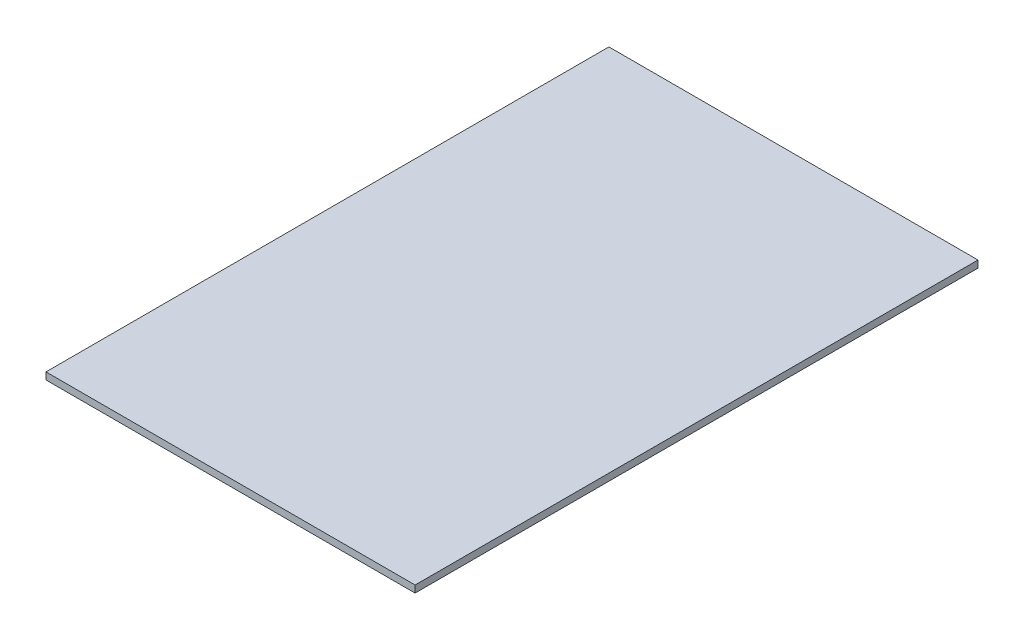
ISO-10303-21;
HEADER;
FILE_DESCRIPTION(('STEP AP214'),'2;1');
FILE_NAME('part.step','',(''),(''),'','','');
FILE_SCHEMA(('AUTOMOTIVE_DESIGN { 1 0 10303 214 1 1 1 1 }'));
ENDSEC;
DATA;
#1=APPLICATION_CONTEXT('core data for automotive mechanical design processes');
#2=APPLICATION_PROTOCOL_DEFINITION('international standard','automotive_design',2000,#1);
#3=PRODUCT_CONTEXT('',#1,'mechanical');
#4=PRODUCT('Part','Part','',(#3));
#5=PRODUCT_RELATED_PRODUCT_CATEGORY('part','',(#4));
#6=PRODUCT_DEFINITION_FORMATION('','',#4);
#7=PRODUCT_DEFINITION_CONTEXT('part definition',#1,'design');
#8=PRODUCT_DEFINITION('design','',#6,#7);
#9=PRODUCT_DEFINITION_SHAPE('','',#8);
#10=(LENGTH_UNIT() NAMED_UNIT(*) SI_UNIT(.MILLI.,.METRE.));
#11=(NAMED_UNIT(*) PLANE_ANGLE_UNIT() SI_UNIT($,.RADIAN.));
#12=(NAMED_UNIT(*) SI_UNIT($,.STERADIAN.) SOLID_ANGLE_UNIT());
#13=UNCERTAINTY_MEASURE_WITH_UNIT(LENGTH_MEASURE(1.E-05),#10,'distance_accuracy_value','');
#14=(GEOMETRIC_REPRESENTATION_CONTEXT(3) GLOBAL_UNCERTAINTY_ASSIGNED_CONTEXT((#13)) GLOBAL_UNIT_ASSIGNED_CONTEXT((#10,
#11,#12)) REPRESENTATION_CONTEXT('',''));
#15=CARTESIAN_POINT('',(0.,0.,0.));
#16=DIRECTION('',(0.,0.,1.));
#17=DIRECTION('',(1.,0.,0.));
#18=AXIS2_PLACEMENT_3D('',#15,#16,#17);
#19=CARTESIAN_POINT('',(500.,9.525,-762.5));
#20=DIRECTION('',(0.,0.,1.));
#21=DIRECTION('',(1.,0.,0.));
#22=AXIS2_PLACEMENT_3D('',#19,#20,#21);
#23=PLANE('',#22);
#24=DIRECTION('',(-1.,0.,0.));
#25=VECTOR('',#24,1.);
#26=CARTESIAN_POINT('',(500.,0.,-762.5));
#27=LINE('',#26,#25);
#28=CARTESIAN_POINT('',(500.,0.,-762.5));
#29=VERTEX_POINT('',#28);
#30=CARTESIAN_POINT('',(0.,0.,-762.5));
#31=VERTEX_POINT('',#30);
#32=EDGE_CURVE('E104',#29,#31,#27,.T.);
#33=ORIENTED_EDGE('',*,*,#32,.T.);
#34=DIRECTION('',(0.,-1.,0.));
#35=VECTOR('',#34,1.);
#36=CARTESIAN_POINT('',(0.,9.525,-762.5));
#37=LINE('',#36,#35);
#38=CARTESIAN_POINT('',(0.,9.525,-762.5));
#39=VERTEX_POINT('',#38);
#40=EDGE_CURVE('E11',#39,#31,#37,.T.);
#41=ORIENTED_EDGE('',*,*,#40,.F.);
#42=DIRECTION('',(-1.,0.,0.));
#43=VECTOR('',#42,1.);
#44=CARTESIAN_POINT('',(500.,9.525,-762.5));
#45=LINE('',#44,#43);
#46=CARTESIAN_POINT('',(500.,9.525,-762.5));
#47=VERTEX_POINT('',#46);
#48=EDGE_CURVE('E92',#47,#39,#45,.T.);
#49=ORIENTED_EDGE('',*,*,#48,.F.);
#50=DIRECTION('',(0.,-1.,0.));
#51=VECTOR('',#50,1.);
#52=CARTESIAN_POINT('',(500.,9.525,-762.5));
#53=LINE('',#52,#51);
#54=EDGE_CURVE('E100',#47,#29,#53,.T.);
#55=ORIENTED_EDGE('',*,*,#54,.T.);
#56=EDGE_LOOP('',(#33,#41,#49,#55));
#57=FACE_BOUND('',#56,.T.);
#58=ADVANCED_FACE('F41',(#57),#23,.F.);
#59=CARTESIAN_POINT('',(0.,9.525,-762.5));
#60=DIRECTION('',(1.,0.,0.));
#61=DIRECTION('',(0.,0.,-1.));
#62=AXIS2_PLACEMENT_3D('',#59,#60,#61);
#63=PLANE('',#62);
#64=DIRECTION('',(0.,0.,1.));
#65=VECTOR('',#64,1.);
#66=CARTESIAN_POINT('',(0.,0.,-762.5));
#67=LINE('',#66,#65);
#68=CARTESIAN_POINT('',(0.,0.,0.));
#69=VERTEX_POINT('',#68);
#70=EDGE_CURVE('E96',#31,#69,#67,.T.);
#71=ORIENTED_EDGE('',*,*,#70,.T.);
#72=DIRECTION('',(0.,-1.,0.));
#73=VECTOR('',#72,1.);
#74=CARTESIAN_POINT('',(0.,9.525,0.));
#75=LINE('',#74,#73);
#76=CARTESIAN_POINT('',(0.,9.525,0.));
#77=VERTEX_POINT('',#76);
#78=EDGE_CURVE('E49',#77,#69,#75,.T.);
#79=ORIENTED_EDGE('',*,*,#78,.F.);
#80=DIRECTION('',(0.,0.,1.));
#81=VECTOR('',#80,1.);
#82=CARTESIAN_POINT('',(0.,9.525,-762.5));
#83=LINE('',#82,#81);
#84=EDGE_CURVE('E87',#39,#77,#83,.T.);
#85=ORIENTED_EDGE('',*,*,#84,.F.);
#86=ORIENTED_EDGE('',*,*,#40,.T.);
#87=EDGE_LOOP('',(#71,#79,#85,#86));
#88=FACE_BOUND('',#87,.T.);
#89=ADVANCED_FACE('F95',(#88),#63,.F.);
#90=CARTESIAN_POINT('',(0.,9.525,0.));
#91=DIRECTION('',(0.,0.,-1.));
#92=DIRECTION('',(-1.,0.,0.));
#93=AXIS2_PLACEMENT_3D('',#90,#91,#92);
#94=PLANE('',#93);
#95=DIRECTION('',(1.,0.,0.));
#96=VECTOR('',#95,1.);
#97=CARTESIAN_POINT('',(0.,0.,0.));
#98=LINE('',#97,#96);
#99=CARTESIAN_POINT('',(500.,0.,2.22044604925031E-13));
#100=VERTEX_POINT('',#99);
#101=EDGE_CURVE('E74',#69,#100,#98,.T.);
#102=ORIENTED_EDGE('',*,*,#101,.T.);
#103=DIRECTION('',(0.,-1.,0.));
#104=VECTOR('',#103,1.);
#105=CARTESIAN_POINT('',(500.,9.525,2.22044604925031E-13));
#106=LINE('',#105,#104);
#107=CARTESIAN_POINT('',(500.,9.525,2.22044604925031E-13));
#108=VERTEX_POINT('',#107);
#109=EDGE_CURVE('E97',#108,#100,#106,.T.);
#110=ORIENTED_EDGE('',*,*,#109,.F.);
#111=DIRECTION('',(1.,0.,0.));
#112=VECTOR('',#111,1.);
#113=CARTESIAN_POINT('',(0.,9.525,0.));
#114=LINE('',#113,#112);
#115=EDGE_CURVE('E90',#77,#108,#114,.T.);
#116=ORIENTED_EDGE('',*,*,#115,.F.);
#117=ORIENTED_EDGE('',*,*,#78,.T.);
#118=EDGE_LOOP('',(#102,#110,#116,#117));
#119=FACE_BOUND('',#118,.T.);
#120=ADVANCED_FACE('F98',(#119),#94,.F.);
#121=CARTESIAN_POINT('',(500.,9.525,2.22044604925031E-13));
#122=DIRECTION('',(-1.,0.,0.));
#123=DIRECTION('',(0.,0.,1.));
#124=AXIS2_PLACEMENT_3D('',#121,#122,#123);
#125=PLANE('',#124);
#126=DIRECTION('',(0.,0.,-1.));
#127=VECTOR('',#126,1.);
#128=CARTESIAN_POINT('',(500.,0.,2.22044604925031E-13));
#129=LINE('',#128,#127);
#130=EDGE_CURVE('E80',#100,#29,#129,.T.);
#131=ORIENTED_EDGE('',*,*,#130,.T.);
#132=ORIENTED_EDGE('',*,*,#54,.F.);
#133=DIRECTION('',(0.,0.,-1.));
#134=VECTOR('',#133,1.);
#135=CARTESIAN_POINT('',(500.,9.525,2.22044604925031E-13));
#136=LINE('',#135,#134);
#137=EDGE_CURVE('E57',#108,#47,#136,.T.);
#138=ORIENTED_EDGE('',*,*,#137,.F.);
#139=ORIENTED_EDGE('',*,*,#109,.T.);
#140=EDGE_LOOP('',(#131,#132,#138,#139));
#141=FACE_BOUND('',#140,.T.);
#142=ADVANCED_FACE('F111',(#141),#125,.F.);
#143=CARTESIAN_POINT('',(0.,9.525,0.));
#144=DIRECTION('',(0.,1.,0.));
#145=DIRECTION('',(0.,0.,1.));
#146=AXIS2_PLACEMENT_3D('',#143,#144,#145);
#147=PLANE('',#146);
#148=ORIENTED_EDGE('',*,*,#48,.T.);
#149=ORIENTED_EDGE('',*,*,#84,.T.);
#150=ORIENTED_EDGE('',*,*,#115,.T.);
#151=ORIENTED_EDGE('',*,*,#137,.T.);
#152=EDGE_LOOP('',(#148,#149,#150,#151));
#153=FACE_BOUND('',#152,.T.);
#154=ADVANCED_FACE('F88',(#153),#147,.T.);
#155=CARTESIAN_POINT('',(0.,0.,0.));
#156=DIRECTION('',(0.,1.,0.));
#157=DIRECTION('',(0.,0.,1.));
#158=AXIS2_PLACEMENT_3D('',#155,#156,#157);
#159=PLANE('',#158);
#160=ORIENTED_EDGE('',*,*,#32,.F.);
#161=ORIENTED_EDGE('',*,*,#130,.F.);
#162=ORIENTED_EDGE('',*,*,#101,.F.);
#163=ORIENTED_EDGE('',*,*,#70,.F.);
#164=EDGE_LOOP('',(#160,#161,#162,#163));
#165=FACE_BOUND('',#164,.T.);
#166=ADVANCED_FACE('F114',(#165),#159,.F.);
#167=CLOSED_SHELL('',(#58,#89,#120,#142,#154,#166));
#168=MANIFOLD_SOLID_BREP('B2',#167);
#169=ADVANCED_BREP_SHAPE_REPRESENTATION('',(#18,#168),#14);
#170=SHAPE_DEFINITION_REPRESENTATION(#9,#169);
ENDSEC;
END-ISO-10303-21;
